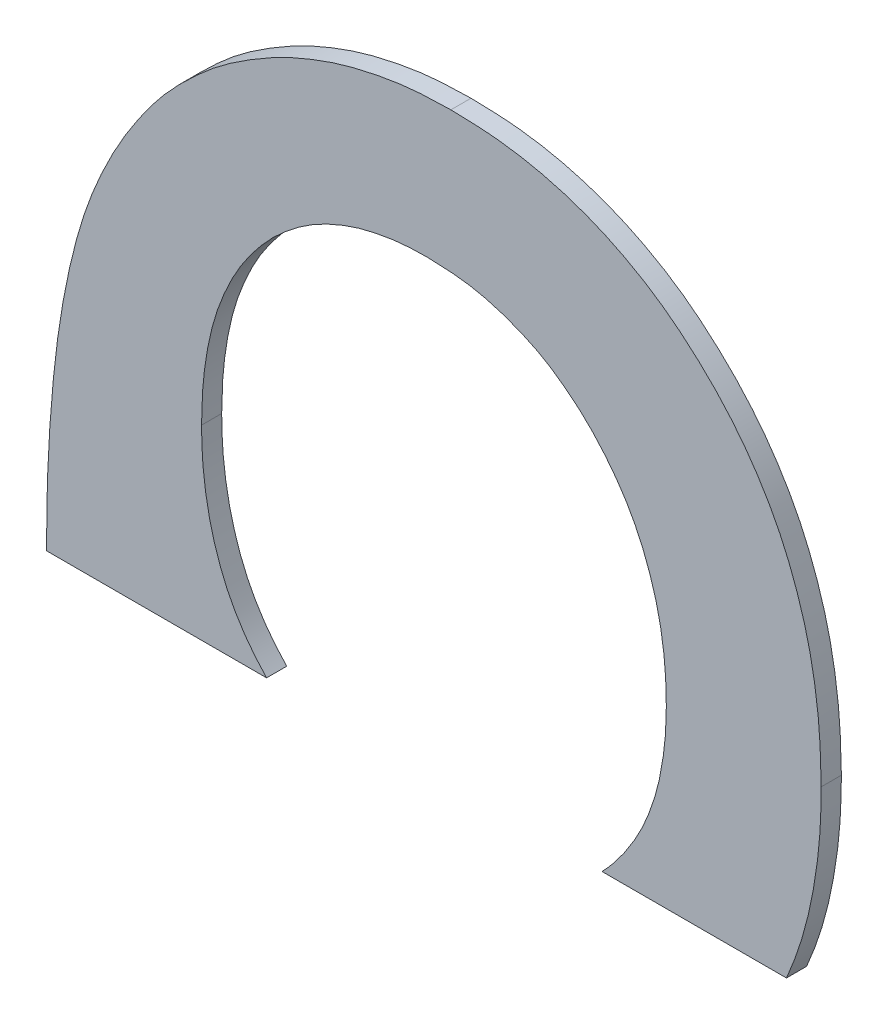
ISO-10303-21;
HEADER;
FILE_DESCRIPTION(('STEP AP214'),'2;1');
FILE_NAME('part.step','',(''),(''),'','','');
FILE_SCHEMA(('AUTOMOTIVE_DESIGN { 1 0 10303 214 1 1 1 1 }'));
ENDSEC;
DATA;
#1=APPLICATION_CONTEXT('core data for automotive mechanical design processes');
#2=APPLICATION_PROTOCOL_DEFINITION('international standard','automotive_design',2000,#1);
#3=PRODUCT_CONTEXT('',#1,'mechanical');
#4=PRODUCT('Part','Part','',(#3));
#5=PRODUCT_RELATED_PRODUCT_CATEGORY('part','',(#4));
#6=PRODUCT_DEFINITION_FORMATION('','',#4);
#7=PRODUCT_DEFINITION_CONTEXT('part definition',#1,'design');
#8=PRODUCT_DEFINITION('design','',#6,#7);
#9=PRODUCT_DEFINITION_SHAPE('','',#8);
#10=(LENGTH_UNIT() NAMED_UNIT(*) SI_UNIT(.MILLI.,.METRE.));
#11=(NAMED_UNIT(*) PLANE_ANGLE_UNIT() SI_UNIT($,.RADIAN.));
#12=(NAMED_UNIT(*) SI_UNIT($,.STERADIAN.) SOLID_ANGLE_UNIT());
#13=UNCERTAINTY_MEASURE_WITH_UNIT(LENGTH_MEASURE(1.E-05),#10,'distance_accuracy_value','');
#14=(GEOMETRIC_REPRESENTATION_CONTEXT(3) GLOBAL_UNCERTAINTY_ASSIGNED_CONTEXT((#13)) GLOBAL_UNIT_ASSIGNED_CONTEXT((#10,
#11,#12)) REPRESENTATION_CONTEXT('',''));
#15=CARTESIAN_POINT('',(0.,0.,0.));
#16=DIRECTION('',(0.,0.,1.));
#17=DIRECTION('',(1.,0.,0.));
#18=AXIS2_PLACEMENT_3D('',#15,#16,#17);
#19=CARTESIAN_POINT('',(1.09975961538463,-4.61538461538462,0.5));
#20=CARTESIAN_POINT('',(1.39275172688461,-4.60779351156357,0.5));
#21=CARTESIAN_POINT('',(1.96951233088625,-4.5928502777596,0.5));
#22=CARTESIAN_POINT('',(2.81436513435677,-4.46003954872113,0.5));
#23=CARTESIAN_POINT('',(3.62694794243341,-4.260870540054,0.5));
#24=CARTESIAN_POINT('',(4.3995606191603,-3.95931901804655,0.5));
#25=CARTESIAN_POINT('',(5.14422391463175,-3.58637737901868,0.5));
#26=CARTESIAN_POINT('',(5.85311888188852,-3.12862011133821,0.5));
#27=CARTESIAN_POINT('',(6.52733785015893,-2.58667027888141,0.5));
#28=CARTESIAN_POINT('',(7.15816883277106,-1.96727608405492,0.5));
#29=CARTESIAN_POINT('',(7.73385760123623,-1.27688019389564,0.5));
#30=CARTESIAN_POINT('',(8.24154865324718,-0.532301956119064,0.5));
#31=CARTESIAN_POINT('',(8.66313461584136,0.270099363711247,0.5));
#32=CARTESIAN_POINT('',(9.01390873164839,1.12030863674847,0.5));
#33=CARTESIAN_POINT('',(9.28456788759542,2.02654063045684,0.5));
#34=CARTESIAN_POINT('',(9.4726405706309,2.98667193693746,0.5));
#35=CARTESIAN_POINT('',(9.59912847814889,3.99703747056771,0.5));
#36=CARTESIAN_POINT('',(9.60989402680231,4.68910345110745,0.5));
#37=CARTESIAN_POINT('',(9.61538461538463,5.04206730769231,0.5));
#38=B_SPLINE_CURVE_WITH_KNOTS('',3,(#19,#20,#21,#22,#23,#24,#25,#26,#27,#28,#29,#30,#31,#32,#33,
#34,#35,#36,#37),.UNSPECIFIED.,.F.,.F.,(4,1,1,1,1,1,1,1,1,1,1,1,1,1,1,1,4),(0.,
0.0609681397471134,0.120016955150697,0.177680928450991,0.234849467672619,0.292303365649365,
0.350847664432185,0.410191854338513,0.472132465675119,0.534617008754283,0.597089020812481,
0.659410464088882,0.723004482865014,0.78832596098028,0.855976404557812,0.926545842281041,1.),.UNSPECIFIED.);
#39=DIRECTION('',(0.,0.,-1.));
#40=VECTOR('',#39,1.);
#41=SURFACE_OF_LINEAR_EXTRUSION('',#38,#40);
#42=CARTESIAN_POINT('',(8.75175876710166,0.5,0.5));
#43=VERTEX_POINT('',#42);
#44=CARTESIAN_POINT('',(9.61538461538463,5.04206730769231,0.5));
#45=VERTEX_POINT('',#44);
#46=EDGE_CURVE('E97',#43,#45,#38,.T.);
#47=ORIENTED_EDGE('',*,*,#46,.F.);
#48=DIRECTION('',(0.,0.,-1.));
#49=VECTOR('',#48,1.);
#50=CARTESIAN_POINT('',(8.75175876717579,0.499999999999999,0.5));
#51=LINE('',#50,#49);
#52=CARTESIAN_POINT('',(8.75175876717579,0.5,0.));
#53=VERTEX_POINT('',#52);
#54=EDGE_CURVE('E79',#43,#53,#51,.T.);
#55=ORIENTED_EDGE('',*,*,#54,.T.);
#56=CARTESIAN_POINT('',(1.09975961538463,-4.61538461538462,0.));
#57=CARTESIAN_POINT('',(1.39275172688461,-4.60779351156357,0.));
#58=CARTESIAN_POINT('',(1.96951233088625,-4.5928502777596,0.));
#59=CARTESIAN_POINT('',(2.81436513435677,-4.46003954872113,0.));
#60=CARTESIAN_POINT('',(3.62694794243341,-4.260870540054,0.));
#61=CARTESIAN_POINT('',(4.3995606191603,-3.95931901804655,0.));
#62=CARTESIAN_POINT('',(5.14422391463175,-3.58637737901868,0.));
#63=CARTESIAN_POINT('',(5.85311888188852,-3.12862011133821,0.));
#64=CARTESIAN_POINT('',(6.52733785015893,-2.58667027888141,0.));
#65=CARTESIAN_POINT('',(7.15816883277106,-1.96727608405492,0.));
#66=CARTESIAN_POINT('',(7.73385760123623,-1.27688019389564,0.));
#67=CARTESIAN_POINT('',(8.24154865324718,-0.532301956119064,0.));
#68=CARTESIAN_POINT('',(8.66313461584136,0.270099363711247,0.));
#69=CARTESIAN_POINT('',(9.01390873164839,1.12030863674847,0.));
#70=CARTESIAN_POINT('',(9.28456788759542,2.02654063045684,0.));
#71=CARTESIAN_POINT('',(9.4726405706309,2.98667193693746,0.));
#72=CARTESIAN_POINT('',(9.59912847814889,3.99703747056771,0.));
#73=CARTESIAN_POINT('',(9.60989402680231,4.68910345110745,0.));
#74=CARTESIAN_POINT('',(9.61538461538463,5.04206730769231,0.));
#75=B_SPLINE_CURVE_WITH_KNOTS('',3,(#56,#57,#58,#59,#60,#61,#62,#63,#64,#65,#66,#67,#68,#69,#70,
#71,#72,#73,#74),.UNSPECIFIED.,.F.,.F.,(4,1,1,1,1,1,1,1,1,1,1,1,1,1,1,1,4),(0.,
0.0609681397471134,0.120016955150697,0.177680928450991,0.234849467672619,0.292303365649365,
0.350847664432185,0.410191854338513,0.472132465675119,0.534617008754283,0.597089020812481,
0.659410464088882,0.723004482865014,0.78832596098028,0.855976404557812,0.926545842281041,1.),.UNSPECIFIED.);
#76=CARTESIAN_POINT('',(9.61538461538463,5.04206730769231,0.));
#77=VERTEX_POINT('',#76);
#78=EDGE_CURVE('E94',#53,#77,#75,.T.);
#79=ORIENTED_EDGE('',*,*,#78,.T.);
#80=DIRECTION('',(0.,0.,-1.));
#81=VECTOR('',#80,1.);
#82=CARTESIAN_POINT('',(9.61538461538463,5.04206730769231,0.5));
#83=LINE('',#82,#81);
#84=EDGE_CURVE('E140',#45,#77,#83,.T.);
#85=ORIENTED_EDGE('',*,*,#84,.F.);
#86=EDGE_LOOP('',(#47,#55,#79,#85));
#87=FACE_BOUND('',#86,.T.);
#88=ADVANCED_FACE('F39',(#87),#41,.F.);
#89=CARTESIAN_POINT('',(-9.6153846153846,0.606971153846152,0.5));
#90=CARTESIAN_POINT('',(-9.61267013812389,0.14415643736996,0.5));
#91=CARTESIAN_POINT('',(-9.60737973115442,-0.757850824599553,0.5));
#92=CARTESIAN_POINT('',(-9.54478600569991,-2.07455251333641,0.5));
#93=CARTESIAN_POINT('',(-9.44996547835485,-3.31922866581833,0.5));
#94=CARTESIAN_POINT('',(-9.32096711501038,-4.49269668245913,0.5));
#95=CARTESIAN_POINT('',(-9.14591242995294,-5.59316558453811,0.5));
#96=CARTESIAN_POINT('',(-8.93784601177733,-6.62044299716237,0.5));
#97=CARTESIAN_POINT('',(-8.69246714224126,-7.57642543805873,0.5));
#98=CARTESIAN_POINT('',(-8.40411122902884,-8.46119684976565,0.5));
#99=CARTESIAN_POINT('',(-8.07630626072311,-9.28492504541425,0.5));
#100=CARTESIAN_POINT('',(-7.71712885237784,-10.0577530402329,0.5));
#101=CARTESIAN_POINT('',(-7.31487005684195,-10.7785379613708,0.5));
#102=CARTESIAN_POINT('',(-6.87404964944979,-11.4486621085819,0.5));
#103=CARTESIAN_POINT('',(-6.40032803559124,-12.0692967741499,0.5));
#104=CARTESIAN_POINT('',(-5.88630882964073,-12.6387793688593,0.5));
#105=CARTESIAN_POINT('',(-5.33182510637523,-13.1553884378136,0.5));
#106=CARTESIAN_POINT('',(-4.74394474841775,-13.6249379057775,0.5));
#107=CARTESIAN_POINT('',(-4.12355002616733,-14.0387289013187,0.5));
#108=CARTESIAN_POINT('',(-3.47908665803332,-14.4038479916955,0.5));
#109=CARTESIAN_POINT('',(-2.80328149002494,-14.7029444290083,0.5));
#110=CARTESIAN_POINT('',(-2.10308199974393,-14.9483124049047,0.5));
#111=CARTESIAN_POINT('',(-1.3797324172776,-15.1509034835826,0.5));
#112=CARTESIAN_POINT('',(-0.627340965708332,-15.2874097197179,0.5));
#113=CARTESIAN_POINT('',(0.150616324964743,-15.3647221830913,0.5));
#114=CARTESIAN_POINT('',(0.676914632344639,-15.3779266816247,0.5));
#115=CARTESIAN_POINT('',(0.943509615384633,-15.3846153846154,0.5));
#116=B_SPLINE_CURVE_WITH_KNOTS('',3,(#89,#90,#91,#92,#93,#94,#95,#96,#97,#98,#99,#100,#101,#102,
#103,#104,#105,#106,#107,#108,#109,#110,#111,#112,#113,#114,#115),.UNSPECIFIED.,.F.,.F.,(4,1,1,
1,1,1,1,1,1,1,1,1,1,1,1,1,1,1,1,1,1,1,1,1,4),(0.,0.0640981711175447,0.124924756643869,
0.182529846909824,0.236977373703482,0.288385756077628,0.336814672908294,0.382104941793347,
0.425010550595459,0.465610515123131,0.504833283861158,0.542966331858558,0.579827525260445,
0.615843650627818,0.651006440697258,0.685948510605445,0.720700592508174,0.75509865415839,
0.789135621494114,0.823166934003109,0.857303272963105,0.89183423886773,0.927098685722523,
0.963072036579118,1.),.UNSPECIFIED.);
#117=DIRECTION('',(0.,0.,-1.));
#118=VECTOR('',#117,1.);
#119=SURFACE_OF_LINEAR_EXTRUSION('',#116,#118);
#120=CARTESIAN_POINT('',(-9.6153846153846,0.606971153846152,0.));
#121=CARTESIAN_POINT('',(-9.61267013812389,0.14415643736996,0.));
#122=CARTESIAN_POINT('',(-9.60737973115442,-0.757850824599553,0.));
#123=CARTESIAN_POINT('',(-9.54478600569991,-2.07455251333641,0.));
#124=CARTESIAN_POINT('',(-9.44996547835485,-3.31922866581833,0.));
#125=CARTESIAN_POINT('',(-9.32096711501038,-4.49269668245913,0.));
#126=CARTESIAN_POINT('',(-9.14591242995294,-5.59316558453811,0.));
#127=CARTESIAN_POINT('',(-8.93784601177733,-6.62044299716237,0.));
#128=CARTESIAN_POINT('',(-8.69246714224126,-7.57642543805873,0.));
#129=CARTESIAN_POINT('',(-8.40411122902884,-8.46119684976565,0.));
#130=CARTESIAN_POINT('',(-8.07630626072311,-9.28492504541425,0.));
#131=CARTESIAN_POINT('',(-7.71712885237784,-10.0577530402329,0.));
#132=CARTESIAN_POINT('',(-7.31487005684195,-10.7785379613708,0.));
#133=CARTESIAN_POINT('',(-6.87404964944979,-11.4486621085819,0.));
#134=CARTESIAN_POINT('',(-6.40032803559124,-12.0692967741499,0.));
#135=CARTESIAN_POINT('',(-5.88630882964073,-12.6387793688593,0.));
#136=CARTESIAN_POINT('',(-5.33182510637523,-13.1553884378136,0.));
#137=CARTESIAN_POINT('',(-4.74394474841775,-13.6249379057775,0.));
#138=CARTESIAN_POINT('',(-4.12355002616733,-14.0387289013187,0.));
#139=CARTESIAN_POINT('',(-3.47908665803332,-14.4038479916955,0.));
#140=CARTESIAN_POINT('',(-2.80328149002494,-14.7029444290083,0.));
#141=CARTESIAN_POINT('',(-2.10308199974393,-14.9483124049047,0.));
#142=CARTESIAN_POINT('',(-1.3797324172776,-15.1509034835826,0.));
#143=CARTESIAN_POINT('',(-0.627340965708332,-15.2874097197179,0.));
#144=CARTESIAN_POINT('',(0.150616324964743,-15.3647221830913,0.));
#145=CARTESIAN_POINT('',(0.676914632344639,-15.3779266816247,0.));
#146=CARTESIAN_POINT('',(0.943509615384633,-15.3846153846154,0.));
#147=B_SPLINE_CURVE_WITH_KNOTS('',3,(#120,#121,#122,#123,#124,#125,#126,#127,#128,#129,#130,
#131,#132,#133,#134,#135,#136,#137,#138,#139,#140,#141,#142,#143,#144,#145,#146),.UNSPECIFIED.,
.F.,.F.,(4,1,1,1,1,1,1,1,1,1,1,1,1,1,1,1,1,1,1,1,1,1,1,1,4),(0.,0.0640981711175447,
0.124924756643869,0.182529846909824,0.236977373703482,0.288385756077628,0.336814672908294,
0.382104941793347,0.425010550595459,0.465610515123131,0.504833283861158,0.542966331858558,
0.579827525260445,0.615843650627818,0.651006440697258,0.685948510605445,0.720700592508174,
0.75509865415839,0.789135621494114,0.823166934003109,0.857303272963105,0.89183423886773,
0.927098685722523,0.963072036579118,1.),.UNSPECIFIED.);
#148=CARTESIAN_POINT('',(-9.6153846153846,0.606971153846152,0.));
#149=VERTEX_POINT('',#148);
#150=CARTESIAN_POINT('',(-9.61475269227853,0.5,0.));
#151=VERTEX_POINT('',#150);
#152=EDGE_CURVE('E101',#149,#151,#147,.T.);
#153=ORIENTED_EDGE('',*,*,#152,.T.);
#154=DIRECTION('',(0.,0.,-1.));
#155=VECTOR('',#154,1.);
#156=CARTESIAN_POINT('',(-9.61475269227853,0.5,0.5));
#157=LINE('',#156,#155);
#158=CARTESIAN_POINT('',(-9.61475269227853,0.5,0.5));
#159=VERTEX_POINT('',#158);
#160=EDGE_CURVE('E53',#151,#159,#157,.F.);
#161=ORIENTED_EDGE('',*,*,#160,.T.);
#162=CARTESIAN_POINT('',(-9.6153846153846,0.606971153846152,0.5));
#163=VERTEX_POINT('',#162);
#164=EDGE_CURVE('E150',#163,#159,#116,.T.);
#165=ORIENTED_EDGE('',*,*,#164,.F.);
#166=DIRECTION('',(0.,0.,-1.));
#167=VECTOR('',#166,1.);
#168=CARTESIAN_POINT('',(-9.6153846153846,0.606971153846152,0.5));
#169=LINE('',#168,#167);
#170=EDGE_CURVE('E143',#163,#149,#169,.T.);
#171=ORIENTED_EDGE('',*,*,#170,.T.);
#172=EDGE_LOOP('',(#153,#161,#165,#171));
#173=FACE_BOUND('',#172,.T.);
#174=ADVANCED_FACE('F239',(#173),#119,.F.);
#175=CARTESIAN_POINT('',(6.68487501787926,-13.2841974867578,0.5));
#176=DIRECTION('',(0.,0.,-1.));
#177=DIRECTION('',(-1.,0.,0.));
#178=AXIS2_PLACEMENT_3D('',#175,#176,#177);
#179=PLANE('',#178);
#180=ORIENTED_EDGE('',*,*,#164,.T.);
#181=DIRECTION('',(1.,0.,0.));
#182=VECTOR('',#181,1.);
#183=CARTESIAN_POINT('',(6.68487501787926,0.5,0.5));
#184=LINE('',#183,#182);
#185=CARTESIAN_POINT('',(-4.15427262840239,0.5,0.5));
#186=VERTEX_POINT('',#185);
#187=EDGE_CURVE('E58',#159,#186,#184,.T.);
#188=ORIENTED_EDGE('',*,*,#187,.T.);
#189=CARTESIAN_POINT('',(-0.0721153846153684,-1.15384615384615,0.5));
#190=CARTESIAN_POINT('',(-0.274685081191588,-1.14977328158864,0.5));
#191=CARTESIAN_POINT('',(-0.673387563703523,-1.14175695778765,0.5));
#192=CARTESIAN_POINT('',(-1.25744480672721,-1.06236867003036,0.5));
#193=CARTESIAN_POINT('',(-1.81240898425206,-0.929402575974411,0.5));
#194=CARTESIAN_POINT('',(-2.34077180885591,-0.748629574870465,0.5));
#195=CARTESIAN_POINT('',(-2.84167690098609,-0.514629744057609,0.5));
#196=CARTESIAN_POINT('',(-3.31175597519857,-0.221483770104905,0.5));
#197=CARTESIAN_POINT('',(-3.76009599169457,0.114387101471254,0.5));
#198=CARTESIAN_POINT('',(-4.17355440197439,0.506835821336498,0.5));
#199=CARTESIAN_POINT('',(-4.55144025189374,0.941353294188342,0.5));
#200=CARTESIAN_POINT('',(-4.87824124380278,1.4222321795736,0.5));
#201=CARTESIAN_POINT('',(-5.15731176174261,1.94073957222652,0.5));
#202=CARTESIAN_POINT('',(-5.3769686596106,2.50302151604002,0.5));
#203=CARTESIAN_POINT('',(-5.55290341998866,3.10215532273428,0.5));
#204=CARTESIAN_POINT('',(-5.67677317981351,3.74193419395728,0.5));
#205=CARTESIAN_POINT('',(-5.75789330980674,4.42099239122179,0.5));
#206=CARTESIAN_POINT('',(-5.76539445965032,4.88757685002568,0.5));
#207=CARTESIAN_POINT('',(-5.76923076923075,5.12620192307692,0.5));
#208=B_SPLINE_CURVE_WITH_KNOTS('',3,(#189,#190,#191,#192,#193,#194,#195,#196,#197,#198,#199,
#200,#201,#202,#203,#204,#205,#206,#207),.UNSPECIFIED.,.F.,.F.,(4,1,1,1,1,1,1,1,1,1,1,1,1,1,1,1,
4),(0.,0.0635627947613132,0.125105800596373,0.184590363575065,0.242460879472413,
0.300129463155241,0.357722568856944,0.416079614598885,0.475690352064488,0.536327121957145,
0.596502370765227,0.657832970047864,0.72077370375448,0.785645050612482,0.853597783500185,
0.925125582415045,1.),.UNSPECIFIED.);
#209=CARTESIAN_POINT('',(-5.76923076923075,5.12620192307692,0.5));
#210=VERTEX_POINT('',#209);
#211=EDGE_CURVE('E199',#186,#210,#208,.T.);
#212=ORIENTED_EDGE('',*,*,#211,.T.);
#213=CARTESIAN_POINT('',(-5.76923076923075,5.12620192307692,0.5));
#214=CARTESIAN_POINT('',(-5.76490502855973,5.36677738239584,0.5));
#215=CARTESIAN_POINT('',(-5.75648525178193,5.83504208426525,0.5));
#216=CARTESIAN_POINT('',(-5.68271776713902,6.51823445833596,0.5));
#217=CARTESIAN_POINT('',(-5.56402636253424,7.16159874435129,0.5));
#218=CARTESIAN_POINT('',(-5.39743421804749,7.76883436751863,0.5));
#219=CARTESIAN_POINT('',(-5.17119714037077,8.33350440681282,0.5));
#220=CARTESIAN_POINT('',(-4.9091169092378,8.86879240082193,0.5));
#221=CARTESIAN_POINT('',(-4.58861915792793,9.35986175008758,0.5));
#222=CARTESIAN_POINT('',(-4.2269937235673,9.81332507221412,0.5));
#223=CARTESIAN_POINT('',(-3.8286560053146,10.2189375477427,0.5));
#224=CARTESIAN_POINT('',(-3.39486990294345,10.5725953509329,0.5));
#225=CARTESIAN_POINT('',(-2.93376857356719,10.875760261698,0.5));
#226=CARTESIAN_POINT('',(-2.43429013073037,11.1141294173166,0.5));
#227=CARTESIAN_POINT('',(-1.91285405811874,11.310544743203,0.5));
#228=CARTESIAN_POINT('',(-1.35693471922605,11.4389141607178,0.5));
#229=CARTESIAN_POINT('',(-0.774181511763851,11.5288395015601,0.5));
#230=CARTESIAN_POINT('',(-0.372962661799704,11.5352109561435,0.5));
#231=CARTESIAN_POINT('',(-0.168269230769215,11.5384615384615,0.5));
#232=B_SPLINE_CURVE_WITH_KNOTS('',3,(#213,#214,#215,#216,#217,#218,#219,#220,#221,#222,#223,
#224,#225,#226,#227,#228,#229,#230,#231),.UNSPECIFIED.,.F.,.F.,(4,1,1,1,1,1,1,1,1,1,1,1,1,1,1,1,
4),(0.,0.0752258737628302,0.14642233854668,0.214622547266868,0.279685653525356,
0.342978023570389,0.404620848444256,0.465793830300087,0.525970485053195,0.585780724236332,
0.643220629232436,0.700742483962275,0.757904941240312,0.815983691139251,0.874640821736925,
0.936044379988317,1.),.UNSPECIFIED.);
#233=CARTESIAN_POINT('',(-0.168269230769215,11.5384615384615,0.5));
#234=VERTEX_POINT('',#233);
#235=EDGE_CURVE('E189',#210,#234,#232,.T.);
#236=ORIENTED_EDGE('',*,*,#235,.T.);
#237=CARTESIAN_POINT('',(-0.168269230769215,11.5384615384615,0.5));
#238=CARTESIAN_POINT('',(0.042276789259701,11.5320814213618,0.5));
#239=CARTESIAN_POINT('',(0.457052988904927,11.5195125743062,0.5));
#240=CARTESIAN_POINT('',(1.06499000726954,11.4385686453195,0.5));
#241=CARTESIAN_POINT('',(1.64154336329438,11.2835859471118,0.5));
#242=CARTESIAN_POINT('',(2.19060545215041,11.0780049115525,0.5));
#243=CARTESIAN_POINT('',(2.71827440354541,10.8237047938177,0.5));
#244=CARTESIAN_POINT('',(3.20536735467957,10.4904939114246,0.5));
#245=CARTESIAN_POINT('',(3.6722854700407,10.1128834001146,0.5));
#246=CARTESIAN_POINT('',(4.10030138312179,9.67480491979246,0.5));
#247=CARTESIAN_POINT('',(4.49127980730797,9.1944991875044,0.5));
#248=CARTESIAN_POINT('',(4.83577489086532,8.67647442952185,0.5));
#249=CARTESIAN_POINT('',(5.12588339769189,8.12047682065899,0.5));
#250=CARTESIAN_POINT('',(5.35778896104686,7.52882448656142,0.5));
#251=CARTESIAN_POINT('',(5.54730940835265,6.90667431385105,0.5));
#252=CARTESIAN_POINT('',(5.67749648069444,6.24846330056418,0.5));
#253=CARTESIAN_POINT('',(5.75760244026443,5.55489217997595,0.5));
#254=CARTESIAN_POINT('',(5.76529688968067,5.08035381516593,0.5));
#255=CARTESIAN_POINT('',(5.76923076923079,4.83774038461538,0.5));
#256=B_SPLINE_CURVE_WITH_KNOTS('',3,(#237,#238,#239,#240,#241,#242,#243,#244,#245,#246,#247,
#248,#249,#250,#251,#252,#253,#254,#255),.UNSPECIFIED.,.F.,.F.,(4,1,1,1,1,1,1,1,1,1,1,1,1,1,1,1,
4),(0.,0.0629478333704659,0.124007393242185,0.182832578583411,0.241004930807748,
0.299118692824409,0.357414200372844,0.416990479040926,0.478389716813706,0.540115145793396,
0.601898641981582,0.664038058498506,0.727199154478891,0.791611086659669,0.858199199660267,
0.927502640088944,1.),.UNSPECIFIED.);
#257=CARTESIAN_POINT('',(5.76923076923079,4.83774038461538,0.5));
#258=VERTEX_POINT('',#257);
#259=EDGE_CURVE('E197',#234,#258,#256,.T.);
#260=ORIENTED_EDGE('',*,*,#259,.T.);
#261=CARTESIAN_POINT('',(5.76923076923079,4.83774038461538,0.5));
#262=CARTESIAN_POINT('',(5.76559753253748,4.62107828632409,0.5));
#263=CARTESIAN_POINT('',(5.75847416780461,4.19628813908102,0.5));
#264=CARTESIAN_POINT('',(5.67364275234917,3.57634561138139,0.5));
#265=CARTESIAN_POINT('',(5.56049023234097,2.98466710580137,0.5));
#266=CARTESIAN_POINT('',(5.38010372830871,2.42729215161989,0.5));
#267=CARTESIAN_POINT('',(5.16279039895238,1.8961287409815,0.5));
#268=CARTESIAN_POINT('',(4.88034990033308,1.40337584742006,0.5));
#269=CARTESIAN_POINT('',(4.56234879705193,0.934299189069977,0.5));
#270=CARTESIAN_POINT('',(4.18974893379179,0.504612898451396,0.5));
#271=CARTESIAN_POINT('',(3.77783898339826,0.114812101552504,0.5));
#272=CARTESIAN_POINT('',(3.32794970507642,-0.224941250153386,0.5));
#273=CARTESIAN_POINT('',(2.845763670524,-0.515776018395924,0.5));
#274=CARTESIAN_POINT('',(2.32680117156969,-0.749856785619088,0.5));
#275=CARTESIAN_POINT('',(1.77417436897692,-0.930133405348942,0.5));
#276=CARTESIAN_POINT('',(1.18911678898298,-1.06285336343452,0.5));
#277=CARTESIAN_POINT('',(0.569085331114844,-1.14190466031389,0.5));
#278=CARTESIAN_POINT('',(0.144461754934995,-1.14981269841211,0.5));
#279=CARTESIAN_POINT('',(-0.0721153846153684,-1.15384615384615,0.5));
#280=B_SPLINE_CURVE_WITH_KNOTS('',3,(#261,#262,#263,#264,#265,#266,#267,#268,#269,#270,#271,
#272,#273,#274,#275,#276,#277,#278,#279),.UNSPECIFIED.,.F.,.F.,(4,1,1,1,1,1,1,1,1,1,1,1,1,1,1,1,
4),(0.,0.0688877507567127,0.135062099084096,0.198816097167165,0.260302455571233,
0.321151150591035,0.381081487065822,0.440665068442198,0.501229320566076,0.561652530159204,
0.620804960677879,0.680272507705816,0.740463287087672,0.801538582632135,0.864937900915904,
0.931112249243287,1.),.UNSPECIFIED.);
#281=CARTESIAN_POINT('',(4.17230734257466,0.500000000005725,0.5));
#282=VERTEX_POINT('',#281);
#283=EDGE_CURVE('E212',#258,#282,#280,.T.);
#284=ORIENTED_EDGE('',*,*,#283,.T.);
#285=EDGE_CURVE('E208',#282,#43,#184,.T.);
#286=ORIENTED_EDGE('',*,*,#285,.T.);
#287=ORIENTED_EDGE('',*,*,#46,.T.);
#288=CARTESIAN_POINT('',(9.61538461538463,5.04206730769231,0.5));
#289=CARTESIAN_POINT('',(9.60716114356035,5.4069876364721,0.5));
#290=CARTESIAN_POINT('',(9.59107460647942,6.12083508751656,0.5));
#291=CARTESIAN_POINT('',(9.46956018919928,7.16456871680285,0.5));
#292=CARTESIAN_POINT('',(9.26852558766631,8.15337644736065,0.5));
#293=CARTESIAN_POINT('',(8.97534435937749,9.08537091163873,0.5));
#294=CARTESIAN_POINT('',(8.61277719842653,9.96654041406888,0.5));
#295=CARTESIAN_POINT('',(8.15559407831402,10.7905319000183,0.5));
#296=CARTESIAN_POINT('',(7.62139924999802,11.5608701806486,0.5));
#297=CARTESIAN_POINT('',(7.00700093094617,12.2701285124618,0.5));
#298=CARTESIAN_POINT('',(6.33178274599692,12.9065295590351,0.5));
#299=CARTESIAN_POINT('',(5.61489651327674,13.4745285719685,0.5));
#300=CARTESIAN_POINT('',(4.84700063681978,13.9414210535052,0.5));
#301=CARTESIAN_POINT('',(4.04281886704542,14.3306929094292,0.5));
#302=CARTESIAN_POINT('',(3.19626536046272,14.6315280660719,0.5));
#303=CARTESIAN_POINT('',(2.30878699935434,14.8489686690376,0.5));
#304=CARTESIAN_POINT('',(1.37792797075313,14.9765560204208,0.5));
#305=CARTESIAN_POINT('',(0.74358313758641,14.9920916603123,0.5));
#306=CARTESIAN_POINT('',(0.420673076923093,15.,0.5));
#307=B_SPLINE_CURVE_WITH_KNOTS('',3,(#288,#289,#290,#291,#292,#293,#294,#295,#296,#297,#298,
#299,#300,#301,#302,#303,#304,#305,#306),.UNSPECIFIED.,.F.,.F.,(4,1,1,1,1,1,1,1,1,1,1,1,1,1,1,1,
4),(0.,0.0719794980830527,0.14080438161902,0.206995292055959,0.270743808999851,
0.333276567096094,0.39465475945677,0.456266609868378,0.517907605259855,0.579409086686877,
0.63909599479918,0.697996639432623,0.756327075312158,0.815077711862346,0.874888784038781,
0.936312762044551,1.),.UNSPECIFIED.);
#308=CARTESIAN_POINT('',(0.420673076923093,15.,0.5));
#309=VERTEX_POINT('',#308);
#310=EDGE_CURVE('E167',#45,#309,#307,.T.);
#311=ORIENTED_EDGE('',*,*,#310,.T.);
#312=CARTESIAN_POINT('',(0.420673076923093,15.,0.5));
#313=CARTESIAN_POINT('',(0.186147331029031,14.9952567943571,0.5));
#314=CARTESIAN_POINT('',(-0.280011433854483,14.9858288875161,0.5));
#315=CARTESIAN_POINT('',(-0.973752448434754,14.9138499213265,0.5));
#316=CARTESIAN_POINT('',(-1.65106576972334,14.7840960526245,0.5));
#317=CARTESIAN_POINT('',(-2.31636740652367,14.6203102058872,0.5));
#318=CARTESIAN_POINT('',(-2.95843557463942,14.3929630980833,0.5));
#319=CARTESIAN_POINT('',(-3.58964712674474,14.1300594443725,0.5));
#320=CARTESIAN_POINT('',(-4.2023887403818,13.8085083907789,0.5));
#321=CARTESIAN_POINT('',(-4.80023078381344,13.4428645493146,0.5));
#322=CARTESIAN_POINT('',(-5.37941834495236,13.0395552503393,0.5));
#323=CARTESIAN_POINT('',(-5.91230428999153,12.5761965117345,0.5));
#324=CARTESIAN_POINT('',(-6.42018776901854,12.0844642227141,0.5));
#325=CARTESIAN_POINT('',(-6.8927340072264,11.5489255563989,0.5));
#326=CARTESIAN_POINT('',(-7.3149964369605,10.9613153832171,0.5));
#327=CARTESIAN_POINT('',(-7.71564228451778,10.3424086204882,0.5));
#328=CARTESIAN_POINT('',(-8.07535843733678,9.67870051308189,0.5));
#329=CARTESIAN_POINT('',(-8.40339459204172,8.96929217165349,0.5));
#330=CARTESIAN_POINT('',(-8.69535949328003,8.19958064521443,0.5));
#331=CARTESIAN_POINT('',(-8.93893136833137,7.3525561386626,0.5));
#332=CARTESIAN_POINT('',(-9.14772680830802,6.42528489705611,0.5));
#333=CARTESIAN_POINT('',(-9.32156959822841,5.41653782095612,0.5));
#334=CARTESIAN_POINT('',(-9.45047686762936,4.32703407098142,0.5));
#335=CARTESIAN_POINT('',(-9.545345088891,3.15839285227736,0.5));
#336=CARTESIAN_POINT('',(-9.60745123913757,1.90972526424343,0.5));
#337=CARTESIAN_POINT('',(-9.61268818450497,1.04975696186308,0.5));
#338=CARTESIAN_POINT('',(-9.6153846153846,0.606971153846152,0.5));
#339=B_SPLINE_CURVE_WITH_KNOTS('',3,(#312,#313,#314,#315,#316,#317,#318,#319,#320,#321,#322,
#323,#324,#325,#326,#327,#328,#329,#330,#331,#332,#333,#334,#335,#336,#337,#338),.UNSPECIFIED.,
.F.,.F.,(4,1,1,1,1,1,1,1,1,1,1,1,1,1,1,1,1,1,1,1,1,1,1,1,4),(0.,0.0354453894961666,
0.0704535825069363,0.105252973359278,0.139620287379646,0.173899462815992,0.208090272461523,
0.24289361457223,0.278359688519495,0.313979226187373,0.3494142689302,0.384956512754364,
0.420787748772961,0.457183790697604,0.494222734479705,0.532160352483514,0.571176076724225,
0.612283309722336,0.656452175691308,0.704268607444703,0.755887109423235,0.811092743409551,
0.870030553818269,0.933080526240561,1.),.UNSPECIFIED.);
#340=EDGE_CURVE('E156',#309,#163,#339,.T.);
#341=ORIENTED_EDGE('',*,*,#340,.T.);
#342=EDGE_LOOP('',(#180,#188,#212,#236,#260,#284,#286,#287,#311,#341));
#343=FACE_BOUND('',#342,.T.);
#344=ADVANCED_FACE('F233',(#343),#179,.F.);
#345=DIRECTION('',(0.,0.,-1.));
#346=VECTOR('',#345,1.);
#347=SURFACE_OF_LINEAR_EXTRUSION('',#208,#346);
#348=ORIENTED_EDGE('',*,*,#211,.F.);
#349=DIRECTION('',(0.,0.,-1.));
#350=VECTOR('',#349,1.);
#351=CARTESIAN_POINT('',(-4.15427262840239,0.5,0.5));
#352=LINE('',#351,#350);
#353=CARTESIAN_POINT('',(-4.15435449658955,0.500081399597013,-2.51160450048713E-07));
#354=VERTEX_POINT('',#353);
#355=EDGE_CURVE('E132',#186,#354,#352,.T.);
#356=ORIENTED_EDGE('',*,*,#355,.T.);
#357=CARTESIAN_POINT('',(-0.0721153846153684,-1.15384615384615,0.));
#358=CARTESIAN_POINT('',(-0.274685081191588,-1.14977328158864,0.));
#359=CARTESIAN_POINT('',(-0.673387563703523,-1.14175695778765,0.));
#360=CARTESIAN_POINT('',(-1.25744480672721,-1.06236867003036,0.));
#361=CARTESIAN_POINT('',(-1.81240898425206,-0.929402575974411,0.));
#362=CARTESIAN_POINT('',(-2.34077180885591,-0.748629574870465,0.));
#363=CARTESIAN_POINT('',(-2.84167690098609,-0.514629744057609,0.));
#364=CARTESIAN_POINT('',(-3.31175597519857,-0.221483770104905,0.));
#365=CARTESIAN_POINT('',(-3.76009599169457,0.114387101471254,0.));
#366=CARTESIAN_POINT('',(-4.17355440197439,0.506835821336498,0.));
#367=CARTESIAN_POINT('',(-4.55144025189374,0.941353294188342,0.));
#368=CARTESIAN_POINT('',(-4.87824124380278,1.4222321795736,0.));
#369=CARTESIAN_POINT('',(-5.15731176174261,1.94073957222652,0.));
#370=CARTESIAN_POINT('',(-5.3769686596106,2.50302151604002,0.));
#371=CARTESIAN_POINT('',(-5.55290341998866,3.10215532273428,0.));
#372=CARTESIAN_POINT('',(-5.67677317981351,3.74193419395728,0.));
#373=CARTESIAN_POINT('',(-5.75789330980674,4.42099239122179,0.));
#374=CARTESIAN_POINT('',(-5.76539445965032,4.88757685002568,0.));
#375=CARTESIAN_POINT('',(-5.76923076923075,5.12620192307692,0.));
#376=B_SPLINE_CURVE_WITH_KNOTS('',3,(#357,#358,#359,#360,#361,#362,#363,#364,#365,#366,#367,
#368,#369,#370,#371,#372,#373,#374,#375),.UNSPECIFIED.,.F.,.F.,(4,1,1,1,1,1,1,1,1,1,1,1,1,1,1,1,
4),(0.,0.0635627947613132,0.125105800596373,0.184590363575065,0.242460879472413,
0.300129463155241,0.357722568856944,0.416079614598885,0.475690352064488,0.536327121957145,
0.596502370765227,0.657832970047864,0.72077370375448,0.785645050612482,0.853597783500185,
0.925125582415045,1.),.UNSPECIFIED.);
#377=CARTESIAN_POINT('',(-5.76923076923075,5.12620192307692,0.));
#378=VERTEX_POINT('',#377);
#379=EDGE_CURVE('E123',#354,#378,#376,.T.);
#380=ORIENTED_EDGE('',*,*,#379,.T.);
#381=DIRECTION('',(0.,0.,-1.));
#382=VECTOR('',#381,1.);
#383=CARTESIAN_POINT('',(-5.76923076923075,5.12620192307692,0.5));
#384=LINE('',#383,#382);
#385=EDGE_CURVE('E88',#210,#378,#384,.T.);
#386=ORIENTED_EDGE('',*,*,#385,.F.);
#387=EDGE_LOOP('',(#348,#356,#380,#386));
#388=FACE_BOUND('',#387,.T.);
#389=ADVANCED_FACE('F227',(#388),#347,.F.);
#390=DIRECTION('',(0.,0.,-1.));
#391=VECTOR('',#390,1.);
#392=SURFACE_OF_LINEAR_EXTRUSION('',#280,#391);
#393=CARTESIAN_POINT('',(5.76923076923079,4.83774038461538,0.));
#394=CARTESIAN_POINT('',(5.76559753253748,4.62107828632409,0.));
#395=CARTESIAN_POINT('',(5.75847416780461,4.19628813908102,0.));
#396=CARTESIAN_POINT('',(5.67364275234917,3.57634561138139,0.));
#397=CARTESIAN_POINT('',(5.56049023234097,2.98466710580137,0.));
#398=CARTESIAN_POINT('',(5.38010372830871,2.42729215161989,0.));
#399=CARTESIAN_POINT('',(5.16279039895238,1.8961287409815,0.));
#400=CARTESIAN_POINT('',(4.88034990033308,1.40337584742006,0.));
#401=CARTESIAN_POINT('',(4.56234879705193,0.934299189069977,0.));
#402=CARTESIAN_POINT('',(4.18974893379179,0.504612898451396,0.));
#403=CARTESIAN_POINT('',(3.77783898339826,0.114812101552504,0.));
#404=CARTESIAN_POINT('',(3.32794970507642,-0.224941250153386,0.));
#405=CARTESIAN_POINT('',(2.845763670524,-0.515776018395924,0.));
#406=CARTESIAN_POINT('',(2.32680117156969,-0.749856785619088,0.));
#407=CARTESIAN_POINT('',(1.77417436897692,-0.930133405348942,0.));
#408=CARTESIAN_POINT('',(1.18911678898298,-1.06285336343452,0.));
#409=CARTESIAN_POINT('',(0.569085331114844,-1.14190466031389,0.));
#410=CARTESIAN_POINT('',(0.144461754934995,-1.14981269841211,0.));
#411=CARTESIAN_POINT('',(-0.0721153846153684,-1.15384615384615,0.));
#412=B_SPLINE_CURVE_WITH_KNOTS('',3,(#393,#394,#395,#396,#397,#398,#399,#400,#401,#402,#403,
#404,#405,#406,#407,#408,#409,#410,#411),.UNSPECIFIED.,.F.,.F.,(4,1,1,1,1,1,1,1,1,1,1,1,1,1,1,1,
4),(0.,0.0688877507567127,0.135062099084096,0.198816097167165,0.260302455571233,
0.321151150591035,0.381081487065822,0.440665068442198,0.501229320566076,0.561652530159204,
0.620804960677879,0.680272507705816,0.740463287087672,0.801538582632135,0.864937900915904,
0.931112249243287,1.),.UNSPECIFIED.);
#413=CARTESIAN_POINT('',(5.76923076923079,4.83774038461538,0.));
#414=VERTEX_POINT('',#413);
#415=CARTESIAN_POINT('',(4.17230734712602,0.5,0.));
#416=VERTEX_POINT('',#415);
#417=EDGE_CURVE('E114',#414,#416,#412,.T.);
#418=ORIENTED_EDGE('',*,*,#417,.T.);
#419=DIRECTION('',(0.,0.,-1.));
#420=VECTOR('',#419,1.);
#421=CARTESIAN_POINT('',(4.17230734256915,0.5,0.5));
#422=LINE('',#421,#420);
#423=EDGE_CURVE('E81',#416,#282,#422,.F.);
#424=ORIENTED_EDGE('',*,*,#423,.T.);
#425=ORIENTED_EDGE('',*,*,#283,.F.);
#426=DIRECTION('',(0.,0.,-1.));
#427=VECTOR('',#426,1.);
#428=CARTESIAN_POINT('',(5.76923076923079,4.83774038461538,0.5));
#429=LINE('',#428,#427);
#430=EDGE_CURVE('E136',#258,#414,#429,.T.);
#431=ORIENTED_EDGE('',*,*,#430,.T.);
#432=EDGE_LOOP('',(#418,#424,#425,#431));
#433=FACE_BOUND('',#432,.T.);
#434=ADVANCED_FACE('F226',(#433),#392,.F.);
#435=DIRECTION('',(0.,0.,-1.));
#436=VECTOR('',#435,1.);
#437=SURFACE_OF_LINEAR_EXTRUSION('',#307,#436);
#438=CARTESIAN_POINT('',(9.61538461538463,5.04206730769231,0.));
#439=CARTESIAN_POINT('',(9.60716114356035,5.4069876364721,0.));
#440=CARTESIAN_POINT('',(9.59107460647942,6.12083508751656,0.));
#441=CARTESIAN_POINT('',(9.46956018919928,7.16456871680285,0.));
#442=CARTESIAN_POINT('',(9.26852558766631,8.15337644736065,0.));
#443=CARTESIAN_POINT('',(8.97534435937749,9.08537091163873,0.));
#444=CARTESIAN_POINT('',(8.61277719842653,9.96654041406888,0.));
#445=CARTESIAN_POINT('',(8.15559407831402,10.7905319000183,0.));
#446=CARTESIAN_POINT('',(7.62139924999802,11.5608701806486,0.));
#447=CARTESIAN_POINT('',(7.00700093094617,12.2701285124618,0.));
#448=CARTESIAN_POINT('',(6.33178274599692,12.9065295590351,0.));
#449=CARTESIAN_POINT('',(5.61489651327674,13.4745285719685,0.));
#450=CARTESIAN_POINT('',(4.84700063681978,13.9414210535052,0.));
#451=CARTESIAN_POINT('',(4.04281886704542,14.3306929094292,0.));
#452=CARTESIAN_POINT('',(3.19626536046272,14.6315280660719,0.));
#453=CARTESIAN_POINT('',(2.30878699935434,14.8489686690376,0.));
#454=CARTESIAN_POINT('',(1.37792797075313,14.9765560204208,0.));
#455=CARTESIAN_POINT('',(0.74358313758641,14.9920916603123,0.));
#456=CARTESIAN_POINT('',(0.420673076923093,15.,0.));
#457=B_SPLINE_CURVE_WITH_KNOTS('',3,(#438,#439,#440,#441,#442,#443,#444,#445,#446,#447,#448,
#449,#450,#451,#452,#453,#454,#455,#456),.UNSPECIFIED.,.F.,.F.,(4,1,1,1,1,1,1,1,1,1,1,1,1,1,1,1,
4),(0.,0.0719794980830527,0.14080438161902,0.206995292055959,0.270743808999851,
0.333276567096094,0.39465475945677,0.456266609868378,0.517907605259855,0.579409086686877,
0.63909599479918,0.697996639432623,0.756327075312158,0.815077711862346,0.874888784038781,
0.936312762044551,1.),.UNSPECIFIED.);
#458=CARTESIAN_POINT('',(0.420673076923093,15.,0.));
#459=VERTEX_POINT('',#458);
#460=EDGE_CURVE('E104',#77,#459,#457,.T.);
#461=ORIENTED_EDGE('',*,*,#460,.T.);
#462=DIRECTION('',(0.,0.,-1.));
#463=VECTOR('',#462,1.);
#464=CARTESIAN_POINT('',(0.420673076923093,15.,0.5));
#465=LINE('',#464,#463);
#466=EDGE_CURVE('E139',#309,#459,#465,.T.);
#467=ORIENTED_EDGE('',*,*,#466,.F.);
#468=ORIENTED_EDGE('',*,*,#310,.F.);
#469=ORIENTED_EDGE('',*,*,#84,.T.);
#470=EDGE_LOOP('',(#461,#467,#468,#469));
#471=FACE_BOUND('',#470,.T.);
#472=ADVANCED_FACE('F179',(#471),#437,.F.);
#473=DIRECTION('',(0.,0.,-1.));
#474=VECTOR('',#473,1.);
#475=SURFACE_OF_LINEAR_EXTRUSION('',#339,#474);
#476=CARTESIAN_POINT('',(0.420673076923093,15.,0.));
#477=CARTESIAN_POINT('',(0.186147331029031,14.9952567943571,0.));
#478=CARTESIAN_POINT('',(-0.280011433854483,14.9858288875161,0.));
#479=CARTESIAN_POINT('',(-0.973752448434754,14.9138499213265,0.));
#480=CARTESIAN_POINT('',(-1.65106576972334,14.7840960526245,0.));
#481=CARTESIAN_POINT('',(-2.31636740652367,14.6203102058872,0.));
#482=CARTESIAN_POINT('',(-2.95843557463942,14.3929630980833,0.));
#483=CARTESIAN_POINT('',(-3.58964712674474,14.1300594443725,0.));
#484=CARTESIAN_POINT('',(-4.2023887403818,13.8085083907789,0.));
#485=CARTESIAN_POINT('',(-4.80023078381344,13.4428645493146,0.));
#486=CARTESIAN_POINT('',(-5.37941834495236,13.0395552503393,0.));
#487=CARTESIAN_POINT('',(-5.91230428999153,12.5761965117345,0.));
#488=CARTESIAN_POINT('',(-6.42018776901854,12.0844642227141,0.));
#489=CARTESIAN_POINT('',(-6.8927340072264,11.5489255563989,0.));
#490=CARTESIAN_POINT('',(-7.3149964369605,10.9613153832171,0.));
#491=CARTESIAN_POINT('',(-7.71564228451778,10.3424086204882,0.));
#492=CARTESIAN_POINT('',(-8.07535843733678,9.67870051308189,0.));
#493=CARTESIAN_POINT('',(-8.40339459204172,8.96929217165349,0.));
#494=CARTESIAN_POINT('',(-8.69535949328003,8.19958064521443,0.));
#495=CARTESIAN_POINT('',(-8.93893136833137,7.3525561386626,0.));
#496=CARTESIAN_POINT('',(-9.14772680830802,6.42528489705611,0.));
#497=CARTESIAN_POINT('',(-9.32156959822841,5.41653782095612,0.));
#498=CARTESIAN_POINT('',(-9.45047686762936,4.32703407098142,0.));
#499=CARTESIAN_POINT('',(-9.545345088891,3.15839285227736,0.));
#500=CARTESIAN_POINT('',(-9.60745123913757,1.90972526424343,0.));
#501=CARTESIAN_POINT('',(-9.61268818450497,1.04975696186308,0.));
#502=CARTESIAN_POINT('',(-9.6153846153846,0.606971153846152,0.));
#503=B_SPLINE_CURVE_WITH_KNOTS('',3,(#476,#477,#478,#479,#480,#481,#482,#483,#484,#485,#486,
#487,#488,#489,#490,#491,#492,#493,#494,#495,#496,#497,#498,#499,#500,#501,#502),.UNSPECIFIED.,
.F.,.F.,(4,1,1,1,1,1,1,1,1,1,1,1,1,1,1,1,1,1,1,1,1,1,1,1,4),(0.,0.0354453894961666,
0.0704535825069363,0.105252973359278,0.139620287379646,0.173899462815992,0.208090272461523,
0.24289361457223,0.278359688519495,0.313979226187373,0.3494142689302,0.384956512754364,
0.420787748772961,0.457183790697604,0.494222734479705,0.532160352483514,0.571176076724225,
0.612283309722336,0.656452175691308,0.704268607444703,0.755887109423235,0.811092743409551,
0.870030553818269,0.933080526240561,1.),.UNSPECIFIED.);
#504=EDGE_CURVE('E137',#459,#149,#503,.T.);
#505=ORIENTED_EDGE('',*,*,#504,.T.);
#506=ORIENTED_EDGE('',*,*,#170,.F.);
#507=ORIENTED_EDGE('',*,*,#340,.F.);
#508=ORIENTED_EDGE('',*,*,#466,.T.);
#509=EDGE_LOOP('',(#505,#506,#507,#508));
#510=FACE_BOUND('',#509,.T.);
#511=ADVANCED_FACE('F176',(#510),#475,.F.);
#512=CARTESIAN_POINT('',(6.68487501787926,-13.2841974867578,0.));
#513=DIRECTION('',(0.,0.,-1.));
#514=DIRECTION('',(-1.,0.,0.));
#515=AXIS2_PLACEMENT_3D('',#512,#513,#514);
#516=PLANE('',#515);
#517=DIRECTION('',(1.,0.,0.));
#518=VECTOR('',#517,1.);
#519=CARTESIAN_POINT('',(6.68487501787926,0.5,0.));
#520=LINE('',#519,#518);
#521=EDGE_CURVE('E11',#151,#354,#520,.T.);
#522=ORIENTED_EDGE('',*,*,#521,.F.);
#523=ORIENTED_EDGE('',*,*,#152,.F.);
#524=ORIENTED_EDGE('',*,*,#504,.F.);
#525=ORIENTED_EDGE('',*,*,#460,.F.);
#526=ORIENTED_EDGE('',*,*,#78,.F.);
#527=DIRECTION('',(1.,0.,0.));
#528=VECTOR('',#527,1.);
#529=CARTESIAN_POINT('',(6.68487501787926,0.5,0.));
#530=LINE('',#529,#528);
#531=EDGE_CURVE('E48',#416,#53,#530,.T.);
#532=ORIENTED_EDGE('',*,*,#531,.F.);
#533=ORIENTED_EDGE('',*,*,#417,.F.);
#534=CARTESIAN_POINT('',(-0.168269230769215,11.5384615384615,0.));
#535=CARTESIAN_POINT('',(0.042276789259701,11.5320814213618,0.));
#536=CARTESIAN_POINT('',(0.457052988904927,11.5195125743062,0.));
#537=CARTESIAN_POINT('',(1.06499000726954,11.4385686453195,0.));
#538=CARTESIAN_POINT('',(1.64154336329438,11.2835859471118,0.));
#539=CARTESIAN_POINT('',(2.19060545215041,11.0780049115525,0.));
#540=CARTESIAN_POINT('',(2.71827440354541,10.8237047938177,0.));
#541=CARTESIAN_POINT('',(3.20536735467957,10.4904939114246,0.));
#542=CARTESIAN_POINT('',(3.6722854700407,10.1128834001146,0.));
#543=CARTESIAN_POINT('',(4.10030138312179,9.67480491979246,0.));
#544=CARTESIAN_POINT('',(4.49127980730797,9.1944991875044,0.));
#545=CARTESIAN_POINT('',(4.83577489086532,8.67647442952185,0.));
#546=CARTESIAN_POINT('',(5.12588339769189,8.12047682065899,0.));
#547=CARTESIAN_POINT('',(5.35778896104686,7.52882448656142,0.));
#548=CARTESIAN_POINT('',(5.54730940835265,6.90667431385105,0.));
#549=CARTESIAN_POINT('',(5.67749648069444,6.24846330056418,0.));
#550=CARTESIAN_POINT('',(5.75760244026443,5.55489217997595,0.));
#551=CARTESIAN_POINT('',(5.76529688968067,5.08035381516593,0.));
#552=CARTESIAN_POINT('',(5.76923076923079,4.83774038461538,0.));
#553=B_SPLINE_CURVE_WITH_KNOTS('',3,(#534,#535,#536,#537,#538,#539,#540,#541,#542,#543,#544,
#545,#546,#547,#548,#549,#550,#551,#552),.UNSPECIFIED.,.F.,.F.,(4,1,1,1,1,1,1,1,1,1,1,1,1,1,1,1,
4),(0.,0.0629478333704659,0.124007393242185,0.182832578583411,0.241004930807748,
0.299118692824409,0.357414200372844,0.416990479040926,0.478389716813706,0.540115145793396,
0.601898641981582,0.664038058498506,0.727199154478891,0.791611086659669,0.858199199660267,
0.927502640088944,1.),.UNSPECIFIED.);
#554=CARTESIAN_POINT('',(-0.168269230769215,11.5384615384615,0.));
#555=VERTEX_POINT('',#554);
#556=EDGE_CURVE('E142',#555,#414,#553,.T.);
#557=ORIENTED_EDGE('',*,*,#556,.F.);
#558=CARTESIAN_POINT('',(-5.76923076923075,5.12620192307692,0.));
#559=CARTESIAN_POINT('',(-5.76490502855973,5.36677738239584,0.));
#560=CARTESIAN_POINT('',(-5.75648525178193,5.83504208426525,0.));
#561=CARTESIAN_POINT('',(-5.68271776713902,6.51823445833596,0.));
#562=CARTESIAN_POINT('',(-5.56402636253424,7.16159874435129,0.));
#563=CARTESIAN_POINT('',(-5.39743421804749,7.76883436751863,0.));
#564=CARTESIAN_POINT('',(-5.17119714037077,8.33350440681282,0.));
#565=CARTESIAN_POINT('',(-4.9091169092378,8.86879240082193,0.));
#566=CARTESIAN_POINT('',(-4.58861915792793,9.35986175008758,0.));
#567=CARTESIAN_POINT('',(-4.2269937235673,9.81332507221412,0.));
#568=CARTESIAN_POINT('',(-3.8286560053146,10.2189375477427,0.));
#569=CARTESIAN_POINT('',(-3.39486990294345,10.5725953509329,0.));
#570=CARTESIAN_POINT('',(-2.93376857356719,10.875760261698,0.));
#571=CARTESIAN_POINT('',(-2.43429013073037,11.1141294173166,0.));
#572=CARTESIAN_POINT('',(-1.91285405811874,11.310544743203,0.));
#573=CARTESIAN_POINT('',(-1.35693471922605,11.4389141607178,0.));
#574=CARTESIAN_POINT('',(-0.774181511763851,11.5288395015601,0.));
#575=CARTESIAN_POINT('',(-0.372962661799704,11.5352109561435,0.));
#576=CARTESIAN_POINT('',(-0.168269230769215,11.5384615384615,0.));
#577=B_SPLINE_CURVE_WITH_KNOTS('',3,(#558,#559,#560,#561,#562,#563,#564,#565,#566,#567,#568,
#569,#570,#571,#572,#573,#574,#575,#576),.UNSPECIFIED.,.F.,.F.,(4,1,1,1,1,1,1,1,1,1,1,1,1,1,1,1,
4),(0.,0.0752258737628302,0.14642233854668,0.214622547266868,0.279685653525356,
0.342978023570389,0.404620848444256,0.465793830300087,0.525970485053195,0.585780724236332,
0.643220629232436,0.700742483962275,0.757904941240312,0.815983691139251,0.874640821736925,
0.936044379988317,1.),.UNSPECIFIED.);
#578=EDGE_CURVE('E278',#378,#555,#577,.T.);
#579=ORIENTED_EDGE('',*,*,#578,.F.);
#580=ORIENTED_EDGE('',*,*,#379,.F.);
#581=EDGE_LOOP('',(#522,#523,#524,#525,#526,#532,#533,#557,#579,#580));
#582=FACE_BOUND('',#581,.T.);
#583=ADVANCED_FACE('F41',(#582),#516,.T.);
#584=DIRECTION('',(0.,0.,-1.));
#585=VECTOR('',#584,1.);
#586=SURFACE_OF_LINEAR_EXTRUSION('',#256,#585);
#587=ORIENTED_EDGE('',*,*,#556,.T.);
#588=ORIENTED_EDGE('',*,*,#430,.F.);
#589=ORIENTED_EDGE('',*,*,#259,.F.);
#590=DIRECTION('',(0.,0.,-1.));
#591=VECTOR('',#590,1.);
#592=CARTESIAN_POINT('',(-0.168269230769215,11.5384615384615,0.5));
#593=LINE('',#592,#591);
#594=EDGE_CURVE('E284',#234,#555,#593,.T.);
#595=ORIENTED_EDGE('',*,*,#594,.T.);
#596=EDGE_LOOP('',(#587,#588,#589,#595));
#597=FACE_BOUND('',#596,.T.);
#598=ADVANCED_FACE('F186',(#597),#586,.F.);
#599=DIRECTION('',(0.,0.,-1.));
#600=VECTOR('',#599,1.);
#601=SURFACE_OF_LINEAR_EXTRUSION('',#232,#600);
#602=ORIENTED_EDGE('',*,*,#578,.T.);
#603=ORIENTED_EDGE('',*,*,#594,.F.);
#604=ORIENTED_EDGE('',*,*,#235,.F.);
#605=ORIENTED_EDGE('',*,*,#385,.T.);
#606=EDGE_LOOP('',(#602,#603,#604,#605));
#607=FACE_BOUND('',#606,.T.);
#608=ADVANCED_FACE('F185',(#607),#601,.F.);
#609=CARTESIAN_POINT('',(-17.,0.5,1.));
#610=DIRECTION('',(0.,1.,0.));
#611=DIRECTION('',(0.,0.,1.));
#612=AXIS2_PLACEMENT_3D('',#609,#610,#611);
#613=PLANE('',#612);
#614=ORIENTED_EDGE('',*,*,#285,.F.);
#615=ORIENTED_EDGE('',*,*,#423,.F.);
#616=ORIENTED_EDGE('',*,*,#531,.T.);
#617=ORIENTED_EDGE('',*,*,#54,.F.);
#618=EDGE_LOOP('',(#614,#615,#616,#617));
#619=FACE_BOUND('',#618,.T.);
#620=ADVANCED_FACE('F80',(#619),#613,.F.);
#621=ORIENTED_EDGE('',*,*,#521,.T.);
#622=ORIENTED_EDGE('',*,*,#355,.F.);
#623=ORIENTED_EDGE('',*,*,#187,.F.);
#624=ORIENTED_EDGE('',*,*,#160,.F.);
#625=EDGE_LOOP('',(#621,#622,#623,#624));
#626=FACE_BOUND('',#625,.T.);
#627=ADVANCED_FACE('F231',(#626),#613,.F.);
#628=CLOSED_SHELL('',(#88,#174,#344,#389,#434,#472,#511,#583,#598,#608,#620,#627));
#629=MANIFOLD_SOLID_BREP('B2',#628);
#630=ADVANCED_BREP_SHAPE_REPRESENTATION('',(#18,#629),#14);
#631=SHAPE_DEFINITION_REPRESENTATION(#9,#630);
ENDSEC;
END-ISO-10303-21;
